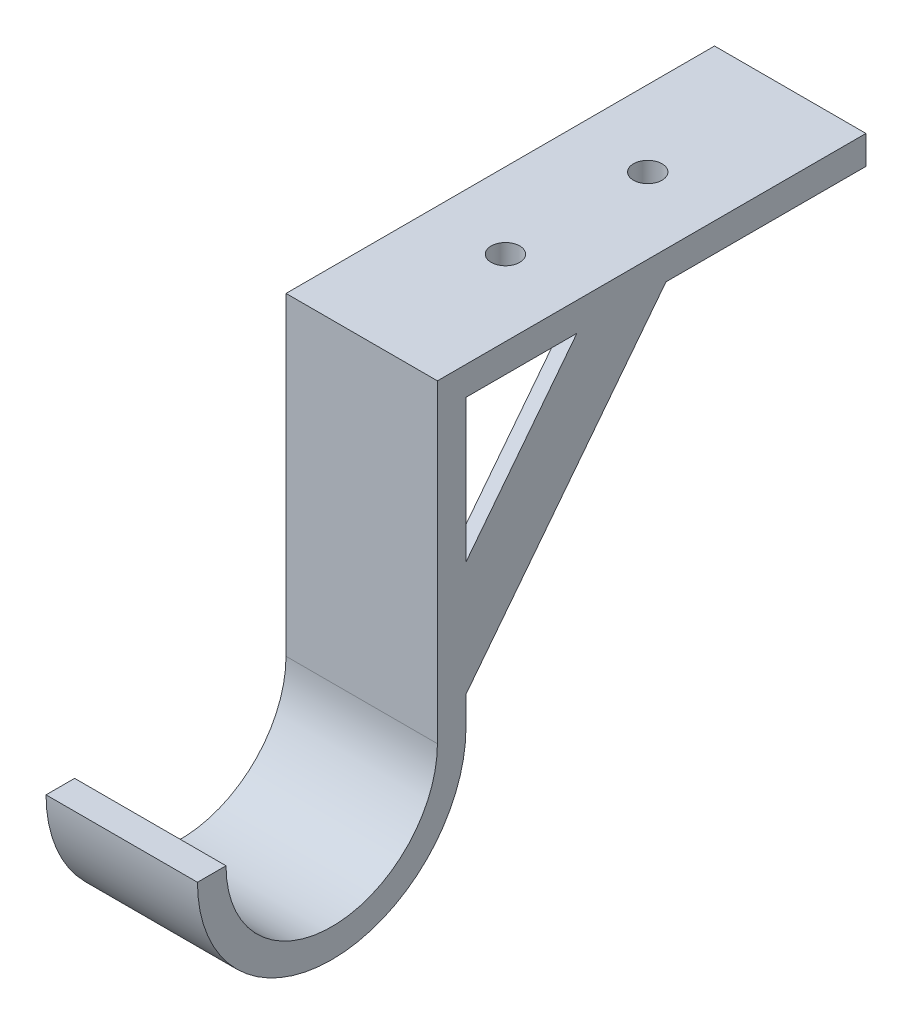
ISO-10303-21;
HEADER;
FILE_DESCRIPTION(('STEP AP214'),'2;1');
FILE_NAME('part.step','',(''),(''),'','','');
FILE_SCHEMA(('AUTOMOTIVE_DESIGN { 1 0 10303 214 1 1 1 1 }'));
ENDSEC;
DATA;
#1=APPLICATION_CONTEXT('core data for automotive mechanical design processes');
#2=APPLICATION_PROTOCOL_DEFINITION('international standard','automotive_design',2000,#1);
#3=PRODUCT_CONTEXT('',#1,'mechanical');
#4=PRODUCT('Part','Part','',(#3));
#5=PRODUCT_RELATED_PRODUCT_CATEGORY('part','',(#4));
#6=PRODUCT_DEFINITION_FORMATION('','',#4);
#7=PRODUCT_DEFINITION_CONTEXT('part definition',#1,'design');
#8=PRODUCT_DEFINITION('design','',#6,#7);
#9=PRODUCT_DEFINITION_SHAPE('','',#8);
#10=(LENGTH_UNIT() NAMED_UNIT(*) SI_UNIT(.MILLI.,.METRE.));
#11=(NAMED_UNIT(*) PLANE_ANGLE_UNIT() SI_UNIT($,.RADIAN.));
#12=(NAMED_UNIT(*) SI_UNIT($,.STERADIAN.) SOLID_ANGLE_UNIT());
#13=UNCERTAINTY_MEASURE_WITH_UNIT(LENGTH_MEASURE(1.E-05),#10,'distance_accuracy_value','');
#14=(GEOMETRIC_REPRESENTATION_CONTEXT(3) GLOBAL_UNCERTAINTY_ASSIGNED_CONTEXT((#13)) GLOBAL_UNIT_ASSIGNED_CONTEXT((#10,
#11,#12)) REPRESENTATION_CONTEXT('',''));
#15=CARTESIAN_POINT('',(0.,0.,0.));
#16=DIRECTION('',(0.,0.,1.));
#17=DIRECTION('',(1.,0.,0.));
#18=AXIS2_PLACEMENT_3D('',#15,#16,#17);
#19=CARTESIAN_POINT('',(0.,0.,0.));
#20=DIRECTION('',(0.,1.,0.));
#21=DIRECTION('',(0.,0.,1.));
#22=AXIS2_PLACEMENT_3D('',#19,#20,#21);
#23=PLANE('',#22);
#24=DIRECTION('',(0.,0.,1.));
#25=VECTOR('',#24,1.);
#26=CARTESIAN_POINT('',(-6.731,0.,-38.1));
#27=LINE('',#26,#25);
#28=CARTESIAN_POINT('',(-6.731,0.,-12.4009738409705));
#29=VERTEX_POINT('',#28);
#30=CARTESIAN_POINT('',(-6.731,0.,-2.54));
#31=VERTEX_POINT('',#30);
#32=EDGE_CURVE('E177',#29,#31,#27,.T.);
#33=ORIENTED_EDGE('',*,*,#32,.F.);
#34=DIRECTION('',(-1.,0.,0.));
#35=VECTOR('',#34,1.);
#36=CARTESIAN_POINT('',(-5.461,0.,-12.4009738409705));
#37=LINE('',#36,#35);
#38=CARTESIAN_POINT('',(-5.461,0.,-12.4009738409705));
#39=VERTEX_POINT('',#38);
#40=EDGE_CURVE('E170',#39,#29,#37,.T.);
#41=ORIENTED_EDGE('',*,*,#40,.F.);
#42=DIRECTION('',(0.,0.,-1.));
#43=VECTOR('',#42,1.);
#44=CARTESIAN_POINT('',(-5.461,0.,-20.32));
#45=LINE('',#44,#43);
#46=CARTESIAN_POINT('',(-5.461,0.,-20.32));
#47=VERTEX_POINT('',#46);
#48=EDGE_CURVE('E157',#39,#47,#45,.T.);
#49=ORIENTED_EDGE('',*,*,#48,.T.);
#50=DIRECTION('',(-1.,0.,0.));
#51=VECTOR('',#50,1.);
#52=CARTESIAN_POINT('',(-5.461,0.,-20.32));
#53=LINE('',#52,#51);
#54=CARTESIAN_POINT('',(-6.731,0.,-20.32));
#55=VERTEX_POINT('',#54);
#56=EDGE_CURVE('E178',#47,#55,#53,.T.);
#57=ORIENTED_EDGE('',*,*,#56,.T.);
#58=CARTESIAN_POINT('',(-6.731,0.,-38.1));
#59=VERTEX_POINT('',#58);
#60=EDGE_CURVE('E256',#59,#55,#27,.T.);
#61=ORIENTED_EDGE('',*,*,#60,.F.);
#62=DIRECTION('',(-1.,0.,0.));
#63=VECTOR('',#62,1.);
#64=CARTESIAN_POINT('',(6.731,0.,-38.1));
#65=LINE('',#64,#63);
#66=CARTESIAN_POINT('',(6.731,0.,-38.1));
#67=VERTEX_POINT('',#66);
#68=EDGE_CURVE('E266',#67,#59,#65,.T.);
#69=ORIENTED_EDGE('',*,*,#68,.F.);
#70=DIRECTION('',(0.,0.,-1.));
#71=VECTOR('',#70,1.);
#72=CARTESIAN_POINT('',(6.731,0.,0.));
#73=LINE('',#72,#71);
#74=CARTESIAN_POINT('',(6.731,0.,-20.32));
#75=VERTEX_POINT('',#74);
#76=EDGE_CURVE('E267',#75,#67,#73,.T.);
#77=ORIENTED_EDGE('',*,*,#76,.F.);
#78=DIRECTION('',(1.,0.,0.));
#79=VECTOR('',#78,1.);
#80=CARTESIAN_POINT('',(5.461,0.,-20.32));
#81=LINE('',#80,#79);
#82=CARTESIAN_POINT('',(5.461,0.,-20.32));
#83=VERTEX_POINT('',#82);
#84=EDGE_CURVE('E210',#83,#75,#81,.T.);
#85=ORIENTED_EDGE('',*,*,#84,.F.);
#86=DIRECTION('',(0.,0.,1.));
#87=VECTOR('',#86,1.);
#88=CARTESIAN_POINT('',(5.461,0.,-12.4009738409705));
#89=LINE('',#88,#87);
#90=CARTESIAN_POINT('',(5.461,0.,-12.4009738409705));
#91=VERTEX_POINT('',#90);
#92=EDGE_CURVE('E193',#83,#91,#89,.T.);
#93=ORIENTED_EDGE('',*,*,#92,.T.);
#94=DIRECTION('',(1.,0.,0.));
#95=VECTOR('',#94,1.);
#96=CARTESIAN_POINT('',(5.461,0.,-12.4009738409705));
#97=LINE('',#96,#95);
#98=CARTESIAN_POINT('',(6.731,0.,-12.4009738409705));
#99=VERTEX_POINT('',#98);
#100=EDGE_CURVE('E207',#91,#99,#97,.T.);
#101=ORIENTED_EDGE('',*,*,#100,.T.);
#102=CARTESIAN_POINT('',(6.731,0.,-2.54));
#103=VERTEX_POINT('',#102);
#104=EDGE_CURVE('E263',#103,#99,#73,.T.);
#105=ORIENTED_EDGE('',*,*,#104,.F.);
#106=DIRECTION('',(1.,0.,0.));
#107=VECTOR('',#106,1.);
#108=CARTESIAN_POINT('',(0.,0.,-2.54));
#109=LINE('',#108,#107);
#110=EDGE_CURVE('E11',#31,#103,#109,.T.);
#111=ORIENTED_EDGE('',*,*,#110,.F.);
#112=EDGE_LOOP('',(#33,#41,#49,#57,#61,#69,#77,#85,#93,#101,#105,#111));
#113=FACE_BOUND('',#112,.T.);
#114=CARTESIAN_POINT('',(0.,0.,-12.7762927293126));
#115=DIRECTION('',(0.,1.,0.));
#116=DIRECTION('',(0.,0.,1.));
#117=AXIS2_PLACEMENT_3D('',#114,#115,#116);
#118=CIRCLE('',#117,1.27);
#119=CARTESIAN_POINT('',(0.,0.,-11.5062927293126));
#120=VERTEX_POINT('',#119);
#121=EDGE_CURVE('E250',#120,#120,#118,.T.);
#122=ORIENTED_EDGE('',*,*,#121,.T.);
#123=EDGE_LOOP('',(#122));
#124=FACE_BOUND('',#123,.T.);
#125=CARTESIAN_POINT('',(0.,0.,-25.4291477290183));
#126=DIRECTION('',(0.,1.,0.));
#127=DIRECTION('',(0.,0.,1.));
#128=AXIS2_PLACEMENT_3D('',#125,#126,#127);
#129=CIRCLE('',#128,1.27);
#130=CARTESIAN_POINT('',(0.,0.,-24.1591477290183));
#131=VERTEX_POINT('',#130);
#132=EDGE_CURVE('E281',#131,#131,#129,.T.);
#133=ORIENTED_EDGE('',*,*,#132,.T.);
#134=EDGE_LOOP('',(#133));
#135=FACE_BOUND('',#134,.T.);
#136=ADVANCED_FACE('F43',(#113,#124,#135),#23,.F.);
#137=CARTESIAN_POINT('',(0.,2.54,0.));
#138=DIRECTION('',(0.,0.,-1.));
#139=DIRECTION('',(-1.,0.,0.));
#140=AXIS2_PLACEMENT_3D('',#137,#138,#139);
#141=PLANE('',#140);
#142=DIRECTION('',(0.,-1.,0.));
#143=VECTOR('',#142,1.);
#144=CARTESIAN_POINT('',(-6.731,2.54,0.));
#145=LINE('',#144,#143);
#146=CARTESIAN_POINT('',(-6.731,2.54,0.));
#147=VERTEX_POINT('',#146);
#148=CARTESIAN_POINT('',(-6.731,-25.4,0.));
#149=VERTEX_POINT('',#148);
#150=EDGE_CURVE('E262',#147,#149,#145,.T.);
#151=ORIENTED_EDGE('',*,*,#150,.T.);
#152=DIRECTION('',(1.,0.,0.));
#153=VECTOR('',#152,1.);
#154=CARTESIAN_POINT('',(-6.731,-25.4,0.));
#155=LINE('',#154,#153);
#156=CARTESIAN_POINT('',(6.731,-25.4,0.));
#157=VERTEX_POINT('',#156);
#158=EDGE_CURVE('E233',#149,#157,#155,.T.);
#159=ORIENTED_EDGE('',*,*,#158,.T.);
#160=DIRECTION('',(0.,-1.,0.));
#161=VECTOR('',#160,1.);
#162=CARTESIAN_POINT('',(6.731,2.54,0.));
#163=LINE('',#162,#161);
#164=CARTESIAN_POINT('',(6.731,2.54,0.));
#165=VERTEX_POINT('',#164);
#166=EDGE_CURVE('E51',#165,#157,#163,.T.);
#167=ORIENTED_EDGE('',*,*,#166,.F.);
#168=DIRECTION('',(1.,0.,0.));
#169=VECTOR('',#168,1.);
#170=CARTESIAN_POINT('',(0.,2.54,0.));
#171=LINE('',#170,#169);
#172=EDGE_CURVE('E253',#147,#165,#171,.T.);
#173=ORIENTED_EDGE('',*,*,#172,.F.);
#174=EDGE_LOOP('',(#151,#159,#167,#173));
#175=FACE_BOUND('',#174,.T.);
#176=ADVANCED_FACE('F45',(#175),#141,.F.);
#177=CARTESIAN_POINT('',(6.731,2.54,0.));
#178=DIRECTION('',(-1.,0.,0.));
#179=DIRECTION('',(0.,0.,1.));
#180=AXIS2_PLACEMENT_3D('',#177,#178,#179);
#181=PLANE('',#180);
#182=ORIENTED_EDGE('',*,*,#104,.T.);
#183=DIRECTION('',(0.,-0.789352217376327,0.61394061351492));
#184=VECTOR('',#183,1.);
#185=CARTESIAN_POINT('',(6.731,-12.6783949383906,-2.54));
#186=LINE('',#185,#184);
#187=CARTESIAN_POINT('',(6.731,-12.6783949383906,-2.54));
#188=VERTEX_POINT('',#187);
#189=EDGE_CURVE('E190',#99,#188,#186,.T.);
#190=ORIENTED_EDGE('',*,*,#189,.T.);
#191=DIRECTION('',(0.,1.,0.));
#192=VECTOR('',#191,1.);
#193=CARTESIAN_POINT('',(6.731,-25.4,-2.54));
#194=LINE('',#193,#192);
#195=EDGE_CURVE('E240',#188,#103,#194,.T.);
#196=ORIENTED_EDGE('',*,*,#195,.T.);
#197=EDGE_LOOP('',(#182,#190,#196));
#198=FACE_BOUND('',#197,.T.);
#199=ORIENTED_EDGE('',*,*,#166,.T.);
#200=CARTESIAN_POINT('',(6.731,-25.4,9.398));
#201=DIRECTION('',(-1.,0.,0.));
#202=DIRECTION('',(0.,0.,1.));
#203=AXIS2_PLACEMENT_3D('',#200,#201,#202);
#204=CIRCLE('',#203,9.398);
#205=CARTESIAN_POINT('',(6.731,-25.4,18.796));
#206=VERTEX_POINT('',#205);
#207=EDGE_CURVE('E221',#157,#206,#204,.T.);
#208=ORIENTED_EDGE('',*,*,#207,.T.);
#209=DIRECTION('',(0.,0.,1.));
#210=VECTOR('',#209,1.);
#211=CARTESIAN_POINT('',(6.731,-25.4,0.));
#212=LINE('',#211,#210);
#213=CARTESIAN_POINT('',(6.731,-25.4,21.336));
#214=VERTEX_POINT('',#213);
#215=EDGE_CURVE('E218',#206,#214,#212,.T.);
#216=ORIENTED_EDGE('',*,*,#215,.T.);
#217=CARTESIAN_POINT('',(6.731,-25.4,9.398));
#218=DIRECTION('',(-1.,0.,0.));
#219=DIRECTION('',(0.,0.,1.));
#220=AXIS2_PLACEMENT_3D('',#217,#218,#219);
#221=CIRCLE('',#220,11.938);
#222=CARTESIAN_POINT('',(6.731,-25.4,-2.54));
#223=VERTEX_POINT('',#222);
#224=EDGE_CURVE('E215',#223,#214,#221,.T.);
#225=ORIENTED_EDGE('',*,*,#224,.F.);
#226=CARTESIAN_POINT('',(6.731,-22.86,-2.54));
#227=VERTEX_POINT('',#226);
#228=EDGE_CURVE('E241',#223,#227,#194,.T.);
#229=ORIENTED_EDGE('',*,*,#228,.T.);
#230=DIRECTION('',(0.,0.789352217376326,-0.61394061351492));
#231=VECTOR('',#230,1.);
#232=CARTESIAN_POINT('',(6.731,-22.86,-2.54));
#233=LINE('',#232,#231);
#234=EDGE_CURVE('E200',#227,#75,#233,.T.);
#235=ORIENTED_EDGE('',*,*,#234,.T.);
#236=ORIENTED_EDGE('',*,*,#76,.T.);
#237=DIRECTION('',(0.,-1.,0.));
#238=VECTOR('',#237,1.);
#239=CARTESIAN_POINT('',(6.731,2.54,-38.1));
#240=LINE('',#239,#238);
#241=CARTESIAN_POINT('',(6.731,2.54,-38.1));
#242=VERTEX_POINT('',#241);
#243=EDGE_CURVE('E275',#242,#67,#240,.T.);
#244=ORIENTED_EDGE('',*,*,#243,.F.);
#245=DIRECTION('',(0.,0.,-1.));
#246=VECTOR('',#245,1.);
#247=CARTESIAN_POINT('',(6.731,2.54,0.));
#248=LINE('',#247,#246);
#249=EDGE_CURVE('E255',#165,#242,#248,.T.);
#250=ORIENTED_EDGE('',*,*,#249,.F.);
#251=EDGE_LOOP('',(#199,#208,#216,#225,#229,#235,#236,#244,#250));
#252=FACE_BOUND('',#251,.T.);
#253=ADVANCED_FACE('F288',(#198,#252),#181,.F.);
#254=CARTESIAN_POINT('',(6.731,2.54,-38.1));
#255=DIRECTION('',(0.,0.,1.));
#256=DIRECTION('',(1.,0.,0.));
#257=AXIS2_PLACEMENT_3D('',#254,#255,#256);
#258=PLANE('',#257);
#259=ORIENTED_EDGE('',*,*,#68,.T.);
#260=DIRECTION('',(0.,-1.,0.));
#261=VECTOR('',#260,1.);
#262=CARTESIAN_POINT('',(-6.731,2.54,-38.1));
#263=LINE('',#262,#261);
#264=CARTESIAN_POINT('',(-6.731,2.54,-38.1));
#265=VERTEX_POINT('',#264);
#266=EDGE_CURVE('E272',#265,#59,#263,.T.);
#267=ORIENTED_EDGE('',*,*,#266,.F.);
#268=DIRECTION('',(-1.,0.,0.));
#269=VECTOR('',#268,1.);
#270=CARTESIAN_POINT('',(6.731,2.54,-38.1));
#271=LINE('',#270,#269);
#272=EDGE_CURVE('E258',#242,#265,#271,.T.);
#273=ORIENTED_EDGE('',*,*,#272,.F.);
#274=ORIENTED_EDGE('',*,*,#243,.T.);
#275=EDGE_LOOP('',(#259,#267,#273,#274));
#276=FACE_BOUND('',#275,.T.);
#277=ADVANCED_FACE('F294',(#276),#258,.F.);
#278=CARTESIAN_POINT('',(-6.731,2.54,-38.1));
#279=DIRECTION('',(1.,0.,0.));
#280=DIRECTION('',(0.,0.,-1.));
#281=AXIS2_PLACEMENT_3D('',#278,#279,#280);
#282=PLANE('',#281);
#283=ORIENTED_EDGE('',*,*,#60,.T.);
#284=DIRECTION('',(0.,-0.789352217376326,0.613940613514921));
#285=VECTOR('',#284,1.);
#286=CARTESIAN_POINT('',(-6.731,-22.86,-2.54));
#287=LINE('',#286,#285);
#288=CARTESIAN_POINT('',(-6.731,-22.86,-2.54));
#289=VERTEX_POINT('',#288);
#290=EDGE_CURVE('E66',#55,#289,#287,.T.);
#291=ORIENTED_EDGE('',*,*,#290,.T.);
#292=DIRECTION('',(0.,-1.,0.));
#293=VECTOR('',#292,1.);
#294=CARTESIAN_POINT('',(-6.731,2.54,-2.54));
#295=LINE('',#294,#293);
#296=CARTESIAN_POINT('',(-6.731,-25.4,-2.54));
#297=VERTEX_POINT('',#296);
#298=EDGE_CURVE('E238',#289,#297,#295,.T.);
#299=ORIENTED_EDGE('',*,*,#298,.T.);
#300=CARTESIAN_POINT('',(-6.731,-25.4,9.398));
#301=DIRECTION('',(-1.,0.,0.));
#302=DIRECTION('',(0.,0.,1.));
#303=AXIS2_PLACEMENT_3D('',#300,#301,#302);
#304=CIRCLE('',#303,11.938);
#305=CARTESIAN_POINT('',(-6.731,-25.4,21.336));
#306=VERTEX_POINT('',#305);
#307=EDGE_CURVE('E206',#297,#306,#304,.T.);
#308=ORIENTED_EDGE('',*,*,#307,.T.);
#309=DIRECTION('',(0.,0.,1.));
#310=VECTOR('',#309,1.);
#311=CARTESIAN_POINT('',(-6.731,-25.4,0.));
#312=LINE('',#311,#310);
#313=CARTESIAN_POINT('',(-6.731,-25.4,18.796));
#314=VERTEX_POINT('',#313);
#315=EDGE_CURVE('E226',#314,#306,#312,.T.);
#316=ORIENTED_EDGE('',*,*,#315,.F.);
#317=CARTESIAN_POINT('',(-6.731,-25.4,9.398));
#318=DIRECTION('',(-1.,0.,0.));
#319=DIRECTION('',(0.,0.,1.));
#320=AXIS2_PLACEMENT_3D('',#317,#318,#319);
#321=CIRCLE('',#320,9.398);
#322=EDGE_CURVE('E219',#149,#314,#321,.T.);
#323=ORIENTED_EDGE('',*,*,#322,.F.);
#324=ORIENTED_EDGE('',*,*,#150,.F.);
#325=DIRECTION('',(0.,0.,1.));
#326=VECTOR('',#325,1.);
#327=CARTESIAN_POINT('',(-6.731,2.54,-38.1));
#328=LINE('',#327,#326);
#329=EDGE_CURVE('E260',#265,#147,#328,.T.);
#330=ORIENTED_EDGE('',*,*,#329,.F.);
#331=ORIENTED_EDGE('',*,*,#266,.T.);
#332=EDGE_LOOP('',(#283,#291,#299,#308,#316,#323,#324,#330,#331));
#333=FACE_BOUND('',#332,.T.);
#334=DIRECTION('',(0.,0.789352217376326,-0.61394061351492));
#335=VECTOR('',#334,1.);
#336=CARTESIAN_POINT('',(-6.731,0.,-12.4009738409705));
#337=LINE('',#336,#335);
#338=CARTESIAN_POINT('',(-6.731,-12.6783949383906,-2.54));
#339=VERTEX_POINT('',#338);
#340=EDGE_CURVE('E58',#339,#29,#337,.T.);
#341=ORIENTED_EDGE('',*,*,#340,.T.);
#342=ORIENTED_EDGE('',*,*,#32,.T.);
#343=EDGE_CURVE('E235',#31,#339,#295,.T.);
#344=ORIENTED_EDGE('',*,*,#343,.T.);
#345=EDGE_LOOP('',(#341,#342,#344));
#346=FACE_BOUND('',#345,.T.);
#347=ADVANCED_FACE('F297',(#333,#346),#282,.F.);
#348=CARTESIAN_POINT('',(0.,2.54,0.));
#349=DIRECTION('',(0.,1.,0.));
#350=DIRECTION('',(0.,0.,1.));
#351=AXIS2_PLACEMENT_3D('',#348,#349,#350);
#352=PLANE('',#351);
#353=ORIENTED_EDGE('',*,*,#249,.T.);
#354=ORIENTED_EDGE('',*,*,#272,.T.);
#355=ORIENTED_EDGE('',*,*,#329,.T.);
#356=ORIENTED_EDGE('',*,*,#172,.T.);
#357=EDGE_LOOP('',(#353,#354,#355,#356));
#358=FACE_BOUND('',#357,.T.);
#359=CARTESIAN_POINT('',(0.,2.54,-25.4291477290183));
#360=DIRECTION('',(0.,1.,0.));
#361=DIRECTION('',(0.,0.,1.));
#362=AXIS2_PLACEMENT_3D('',#359,#360,#361);
#363=CIRCLE('',#362,1.27);
#364=CARTESIAN_POINT('',(0.,2.54,-24.1591477290183));
#365=VERTEX_POINT('',#364);
#366=EDGE_CURVE('E247',#365,#365,#363,.T.);
#367=ORIENTED_EDGE('',*,*,#366,.F.);
#368=EDGE_LOOP('',(#367));
#369=FACE_BOUND('',#368,.T.);
#370=CARTESIAN_POINT('',(0.,2.54,-12.7762927293126));
#371=DIRECTION('',(0.,1.,0.));
#372=DIRECTION('',(0.,0.,1.));
#373=AXIS2_PLACEMENT_3D('',#370,#371,#372);
#374=CIRCLE('',#373,1.27);
#375=CARTESIAN_POINT('',(0.,2.54,-11.5062927293126));
#376=VERTEX_POINT('',#375);
#377=EDGE_CURVE('E244',#376,#376,#374,.T.);
#378=ORIENTED_EDGE('',*,*,#377,.F.);
#379=EDGE_LOOP('',(#378));
#380=FACE_BOUND('',#379,.T.);
#381=ADVANCED_FACE('F303',(#358,#369,#380),#352,.T.);
#382=CARTESIAN_POINT('',(0.,-2.794,-12.7762927293126));
#383=DIRECTION('',(0.,1.,0.));
#384=DIRECTION('',(0.,0.,1.));
#385=AXIS2_PLACEMENT_3D('',#382,#383,#384);
#386=CYLINDRICAL_SURFACE('',#385,1.27);
#387=ORIENTED_EDGE('',*,*,#377,.T.);
#388=EDGE_LOOP('',(#387));
#389=FACE_BOUND('',#388,.T.);
#390=ORIENTED_EDGE('',*,*,#121,.F.);
#391=EDGE_LOOP('',(#390));
#392=FACE_BOUND('',#391,.T.);
#393=ADVANCED_FACE('F342',(#389,#392),#386,.F.);
#394=CARTESIAN_POINT('',(0.,-2.794,-25.4291477290183));
#395=DIRECTION('',(0.,1.,0.));
#396=DIRECTION('',(0.,0.,1.));
#397=AXIS2_PLACEMENT_3D('',#394,#395,#396);
#398=CYLINDRICAL_SURFACE('',#397,1.27);
#399=ORIENTED_EDGE('',*,*,#366,.T.);
#400=EDGE_LOOP('',(#399));
#401=FACE_BOUND('',#400,.T.);
#402=ORIENTED_EDGE('',*,*,#132,.F.);
#403=EDGE_LOOP('',(#402));
#404=FACE_BOUND('',#403,.T.);
#405=ADVANCED_FACE('F354',(#401,#404),#398,.F.);
#406=CARTESIAN_POINT('',(0.,0.,-2.54));
#407=DIRECTION('',(0.,0.,1.));
#408=DIRECTION('',(1.,0.,0.));
#409=AXIS2_PLACEMENT_3D('',#406,#407,#408);
#410=PLANE('',#409);
#411=DIRECTION('',(0.,1.,0.));
#412=VECTOR('',#411,1.);
#413=CARTESIAN_POINT('',(-5.461,-12.6783949383906,-2.54));
#414=LINE('',#413,#412);
#415=CARTESIAN_POINT('',(-5.461,-22.86,-2.54));
#416=VERTEX_POINT('',#415);
#417=CARTESIAN_POINT('',(-5.461,-12.6783949383906,-2.54));
#418=VERTEX_POINT('',#417);
#419=EDGE_CURVE('E179',#416,#418,#414,.T.);
#420=ORIENTED_EDGE('',*,*,#419,.T.);
#421=DIRECTION('',(-1.,0.,0.));
#422=VECTOR('',#421,1.);
#423=CARTESIAN_POINT('',(-5.461,-12.6783949383906,-2.54));
#424=LINE('',#423,#422);
#425=EDGE_CURVE('E173',#418,#339,#424,.T.);
#426=ORIENTED_EDGE('',*,*,#425,.T.);
#427=ORIENTED_EDGE('',*,*,#343,.F.);
#428=ORIENTED_EDGE('',*,*,#110,.T.);
#429=ORIENTED_EDGE('',*,*,#195,.F.);
#430=DIRECTION('',(1.,0.,0.));
#431=VECTOR('',#430,1.);
#432=CARTESIAN_POINT('',(5.461,-12.6783949383906,-2.54));
#433=LINE('',#432,#431);
#434=CARTESIAN_POINT('',(5.461,-12.6783949383906,-2.54));
#435=VERTEX_POINT('',#434);
#436=EDGE_CURVE('E203',#435,#188,#433,.T.);
#437=ORIENTED_EDGE('',*,*,#436,.F.);
#438=DIRECTION('',(0.,-1.,0.));
#439=VECTOR('',#438,1.);
#440=CARTESIAN_POINT('',(5.461,-22.86,-2.54));
#441=LINE('',#440,#439);
#442=CARTESIAN_POINT('',(5.461,-22.86,-2.54));
#443=VERTEX_POINT('',#442);
#444=EDGE_CURVE('E186',#435,#443,#441,.T.);
#445=ORIENTED_EDGE('',*,*,#444,.T.);
#446=DIRECTION('',(1.,0.,0.));
#447=VECTOR('',#446,1.);
#448=CARTESIAN_POINT('',(5.461,-22.86,-2.54));
#449=LINE('',#448,#447);
#450=EDGE_CURVE('E199',#443,#227,#449,.T.);
#451=ORIENTED_EDGE('',*,*,#450,.T.);
#452=ORIENTED_EDGE('',*,*,#228,.F.);
#453=DIRECTION('',(1.,0.,0.));
#454=VECTOR('',#453,1.);
#455=CARTESIAN_POINT('',(-6.731,-25.4,-2.54));
#456=LINE('',#455,#454);
#457=EDGE_CURVE('E237',#297,#223,#456,.T.);
#458=ORIENTED_EDGE('',*,*,#457,.F.);
#459=ORIENTED_EDGE('',*,*,#298,.F.);
#460=DIRECTION('',(-1.,0.,0.));
#461=VECTOR('',#460,1.);
#462=CARTESIAN_POINT('',(-5.461,-22.86,-2.54));
#463=LINE('',#462,#461);
#464=EDGE_CURVE('E181',#416,#289,#463,.T.);
#465=ORIENTED_EDGE('',*,*,#464,.F.);
#466=EDGE_LOOP('',(#420,#426,#427,#428,#429,#437,#445,#451,#452,#458,#459,#465));
#467=FACE_BOUND('',#466,.T.);
#468=ADVANCED_FACE('F321',(#467),#410,.F.);
#469=CARTESIAN_POINT('',(6.731,-25.4,9.398));
#470=DIRECTION('',(-1.,0.,0.));
#471=DIRECTION('',(0.,0.,1.));
#472=AXIS2_PLACEMENT_3D('',#469,#470,#471);
#473=CYLINDRICAL_SURFACE('',#472,9.398);
#474=ORIENTED_EDGE('',*,*,#322,.T.);
#475=DIRECTION('',(-1.,0.,0.));
#476=VECTOR('',#475,1.);
#477=CARTESIAN_POINT('',(6.731,-25.4,18.796));
#478=LINE('',#477,#476);
#479=EDGE_CURVE('E230',#206,#314,#478,.T.);
#480=ORIENTED_EDGE('',*,*,#479,.F.);
#481=ORIENTED_EDGE('',*,*,#207,.F.);
#482=ORIENTED_EDGE('',*,*,#158,.F.);
#483=EDGE_LOOP('',(#474,#480,#481,#482));
#484=FACE_BOUND('',#483,.T.);
#485=ADVANCED_FACE('F309',(#484),#473,.F.);
#486=CARTESIAN_POINT('',(6.731,-25.4,0.));
#487=DIRECTION('',(0.,-1.,0.));
#488=DIRECTION('',(0.,0.,-1.));
#489=AXIS2_PLACEMENT_3D('',#486,#487,#488);
#490=PLANE('',#489);
#491=ORIENTED_EDGE('',*,*,#315,.T.);
#492=DIRECTION('',(-1.,0.,0.));
#493=VECTOR('',#492,1.);
#494=CARTESIAN_POINT('',(6.731,-25.4,21.336));
#495=LINE('',#494,#493);
#496=EDGE_CURVE('E223',#214,#306,#495,.T.);
#497=ORIENTED_EDGE('',*,*,#496,.F.);
#498=ORIENTED_EDGE('',*,*,#215,.F.);
#499=ORIENTED_EDGE('',*,*,#479,.T.);
#500=EDGE_LOOP('',(#491,#497,#498,#499));
#501=FACE_BOUND('',#500,.T.);
#502=ADVANCED_FACE('F314',(#501),#490,.F.);
#503=CARTESIAN_POINT('',(6.731,-25.4,9.398));
#504=DIRECTION('',(-1.,0.,0.));
#505=DIRECTION('',(0.,0.,1.));
#506=AXIS2_PLACEMENT_3D('',#503,#504,#505);
#507=CYLINDRICAL_SURFACE('',#506,11.938);
#508=ORIENTED_EDGE('',*,*,#307,.F.);
#509=ORIENTED_EDGE('',*,*,#457,.T.);
#510=ORIENTED_EDGE('',*,*,#224,.T.);
#511=ORIENTED_EDGE('',*,*,#496,.T.);
#512=EDGE_LOOP('',(#508,#509,#510,#511));
#513=FACE_BOUND('',#512,.T.);
#514=ADVANCED_FACE('F360',(#513),#507,.T.);
#515=CARTESIAN_POINT('',(5.461,-12.6783949383906,-2.54));
#516=DIRECTION('',(0.,0.61394061351492,0.789352217376326));
#517=DIRECTION('',(0.,-0.789352217376327,0.61394061351492));
#518=AXIS2_PLACEMENT_3D('',#515,#516,#517);
#519=PLANE('',#518);
#520=ORIENTED_EDGE('',*,*,#189,.F.);
#521=ORIENTED_EDGE('',*,*,#100,.F.);
#522=DIRECTION('',(0.,-0.789352217376327,0.61394061351492));
#523=VECTOR('',#522,1.);
#524=CARTESIAN_POINT('',(5.461,-12.6783949383906,-2.54));
#525=LINE('',#524,#523);
#526=EDGE_CURVE('E196',#91,#435,#525,.T.);
#527=ORIENTED_EDGE('',*,*,#526,.T.);
#528=ORIENTED_EDGE('',*,*,#436,.T.);
#529=EDGE_LOOP('',(#520,#521,#527,#528));
#530=FACE_BOUND('',#529,.T.);
#531=ADVANCED_FACE('F363',(#530),#519,.T.);
#532=CARTESIAN_POINT('',(5.461,-22.86,-2.54));
#533=DIRECTION('',(0.,-0.61394061351492,-0.789352217376326));
#534=DIRECTION('',(0.,0.789352217376327,-0.61394061351492));
#535=AXIS2_PLACEMENT_3D('',#532,#533,#534);
#536=PLANE('',#535);
#537=ORIENTED_EDGE('',*,*,#234,.F.);
#538=ORIENTED_EDGE('',*,*,#450,.F.);
#539=DIRECTION('',(0.,0.789352217376326,-0.61394061351492));
#540=VECTOR('',#539,1.);
#541=CARTESIAN_POINT('',(5.461,-22.86,-2.54));
#542=LINE('',#541,#540);
#543=EDGE_CURVE('E189',#443,#83,#542,.T.);
#544=ORIENTED_EDGE('',*,*,#543,.T.);
#545=ORIENTED_EDGE('',*,*,#84,.T.);
#546=EDGE_LOOP('',(#537,#538,#544,#545));
#547=FACE_BOUND('',#546,.T.);
#548=ADVANCED_FACE('F326',(#547),#536,.T.);
#549=CARTESIAN_POINT('',(5.461,0.,0.));
#550=DIRECTION('',(-1.,0.,0.));
#551=DIRECTION('',(0.,0.,1.));
#552=AXIS2_PLACEMENT_3D('',#549,#550,#551);
#553=PLANE('',#552);
#554=ORIENTED_EDGE('',*,*,#444,.F.);
#555=ORIENTED_EDGE('',*,*,#526,.F.);
#556=ORIENTED_EDGE('',*,*,#92,.F.);
#557=ORIENTED_EDGE('',*,*,#543,.F.);
#558=EDGE_LOOP('',(#554,#555,#556,#557));
#559=FACE_BOUND('',#558,.T.);
#560=ADVANCED_FACE('F328',(#559),#553,.T.);
#561=CARTESIAN_POINT('',(-5.461,0.,-12.4009738409705));
#562=DIRECTION('',(0.,0.61394061351492,0.789352217376326));
#563=DIRECTION('',(0.,-0.789352217376327,0.61394061351492));
#564=AXIS2_PLACEMENT_3D('',#561,#562,#563);
#565=PLANE('',#564);
#566=ORIENTED_EDGE('',*,*,#340,.F.);
#567=ORIENTED_EDGE('',*,*,#425,.F.);
#568=DIRECTION('',(0.,0.789352217376326,-0.61394061351492));
#569=VECTOR('',#568,1.);
#570=CARTESIAN_POINT('',(-5.461,0.,-12.4009738409705));
#571=LINE('',#570,#569);
#572=EDGE_CURVE('E161',#418,#39,#571,.T.);
#573=ORIENTED_EDGE('',*,*,#572,.T.);
#574=ORIENTED_EDGE('',*,*,#40,.T.);
#575=EDGE_LOOP('',(#566,#567,#573,#574));
#576=FACE_BOUND('',#575,.T.);
#577=ADVANCED_FACE('F169',(#576),#565,.T.);
#578=CARTESIAN_POINT('',(-5.461,-22.86,-2.54));
#579=DIRECTION('',(0.,-0.613940613514921,-0.789352217376326));
#580=DIRECTION('',(0.,0.789352217376326,-0.613940613514921));
#581=AXIS2_PLACEMENT_3D('',#578,#579,#580);
#582=PLANE('',#581);
#583=ORIENTED_EDGE('',*,*,#290,.F.);
#584=ORIENTED_EDGE('',*,*,#56,.F.);
#585=DIRECTION('',(0.,-0.789352217376326,0.613940613514921));
#586=VECTOR('',#585,1.);
#587=CARTESIAN_POINT('',(-5.461,-22.86,-2.54));
#588=LINE('',#587,#586);
#589=EDGE_CURVE('E163',#47,#416,#588,.T.);
#590=ORIENTED_EDGE('',*,*,#589,.T.);
#591=ORIENTED_EDGE('',*,*,#464,.T.);
#592=EDGE_LOOP('',(#583,#584,#590,#591));
#593=FACE_BOUND('',#592,.T.);
#594=ADVANCED_FACE('F375',(#593),#582,.T.);
#595=CARTESIAN_POINT('',(-5.461,0.,0.));
#596=DIRECTION('',(-1.,0.,0.));
#597=DIRECTION('',(0.,0.,1.));
#598=AXIS2_PLACEMENT_3D('',#595,#596,#597);
#599=PLANE('',#598);
#600=ORIENTED_EDGE('',*,*,#572,.F.);
#601=ORIENTED_EDGE('',*,*,#419,.F.);
#602=ORIENTED_EDGE('',*,*,#589,.F.);
#603=ORIENTED_EDGE('',*,*,#48,.F.);
#604=EDGE_LOOP('',(#600,#601,#602,#603));
#605=FACE_BOUND('',#604,.T.);
#606=ADVANCED_FACE('F159',(#605),#599,.F.);
#607=CLOSED_SHELL('',(#136,#176,#253,#277,#347,#381,#393,#405,#468,#485,#502,#514,#531,#548,
#560,#577,#594,#606));
#608=MANIFOLD_SOLID_BREP('B2',#607);
#609=ADVANCED_BREP_SHAPE_REPRESENTATION('',(#18,#608),#14);
#610=SHAPE_DEFINITION_REPRESENTATION(#9,#609);
ENDSEC;
END-ISO-10303-21;
